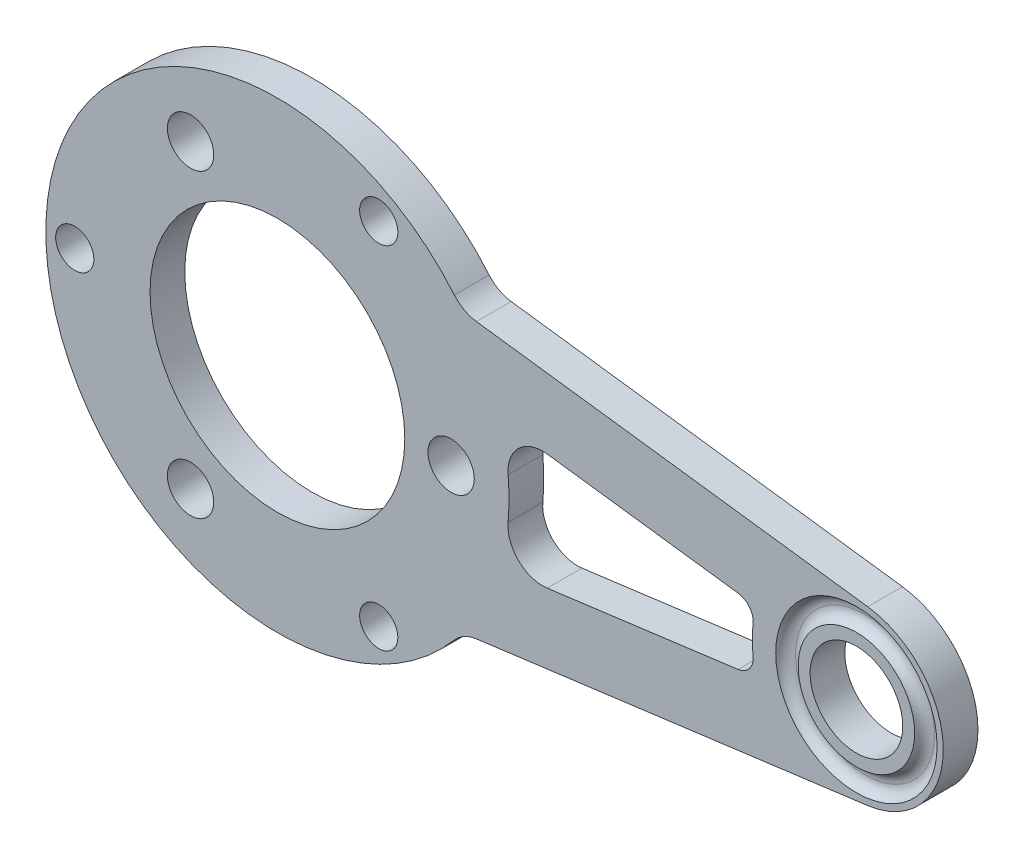
ISO-10303-21;
HEADER;
FILE_DESCRIPTION(('STEP AP214'),'2;1');
FILE_NAME('part.step','',(''),(''),'','','');
FILE_SCHEMA(('AUTOMOTIVE_DESIGN { 1 0 10303 214 1 1 1 1 }'));
ENDSEC;
DATA;
#1=APPLICATION_CONTEXT('core data for automotive mechanical design processes');
#2=APPLICATION_PROTOCOL_DEFINITION('international standard','automotive_design',2000,#1);
#3=PRODUCT_CONTEXT('',#1,'mechanical');
#4=PRODUCT('Part','Part','',(#3));
#5=PRODUCT_RELATED_PRODUCT_CATEGORY('part','',(#4));
#6=PRODUCT_DEFINITION_FORMATION('','',#4);
#7=PRODUCT_DEFINITION_CONTEXT('part definition',#1,'design');
#8=PRODUCT_DEFINITION('design','',#6,#7);
#9=PRODUCT_DEFINITION_SHAPE('','',#8);
#10=(LENGTH_UNIT() NAMED_UNIT(*) SI_UNIT(.MILLI.,.METRE.));
#11=(NAMED_UNIT(*) PLANE_ANGLE_UNIT() SI_UNIT($,.RADIAN.));
#12=(NAMED_UNIT(*) SI_UNIT($,.STERADIAN.) SOLID_ANGLE_UNIT());
#13=UNCERTAINTY_MEASURE_WITH_UNIT(LENGTH_MEASURE(1.E-05),#10,'distance_accuracy_value','');
#14=(GEOMETRIC_REPRESENTATION_CONTEXT(3) GLOBAL_UNCERTAINTY_ASSIGNED_CONTEXT((#13)) GLOBAL_UNIT_ASSIGNED_CONTEXT((#10,
#11,#12)) REPRESENTATION_CONTEXT('',''));
#15=CARTESIAN_POINT('',(0.,0.,0.));
#16=DIRECTION('',(0.,0.,1.));
#17=DIRECTION('',(1.,0.,0.));
#18=AXIS2_PLACEMENT_3D('',#15,#16,#17);
#19=CARTESIAN_POINT('',(0.,0.,3.));
#20=DIRECTION('',(0.,0.,1.));
#21=DIRECTION('',(1.,0.,0.));
#22=AXIS2_PLACEMENT_3D('',#19,#20,#21);
#23=PLANE('',#22);
#24=CARTESIAN_POINT('',(-7.49999999999988,12.9903810567666,3.));
#25=DIRECTION('',(0.,0.,1.));
#26=DIRECTION('',(1.,0.,0.));
#27=AXIS2_PLACEMENT_3D('',#24,#25,#26);
#28=CIRCLE('',#27,2.);
#29=CARTESIAN_POINT('',(-5.49999999999988,12.9903810567666,3.));
#30=VERTEX_POINT('',#29);
#31=EDGE_CURVE('E344',#30,#30,#28,.T.);
#32=ORIENTED_EDGE('',*,*,#31,.F.);
#33=EDGE_LOOP('',(#32));
#34=FACE_BOUND('',#33,.T.);
#35=CARTESIAN_POINT('',(8.74999999999986,-15.1554445662278,3.));
#36=DIRECTION('',(0.,0.,1.));
#37=DIRECTION('',(1.,0.,0.));
#38=AXIS2_PLACEMENT_3D('',#35,#36,#37);
#39=CIRCLE('',#38,1.65);
#40=CARTESIAN_POINT('',(10.3999999999999,-15.1554445662278,3.));
#41=VERTEX_POINT('',#40);
#42=EDGE_CURVE('E333',#41,#41,#39,.T.);
#43=ORIENTED_EDGE('',*,*,#42,.F.);
#44=EDGE_LOOP('',(#43));
#45=FACE_BOUND('',#44,.T.);
#46=CARTESIAN_POINT('',(8.75000000000007,15.1554445662276,3.));
#47=DIRECTION('',(0.,0.,1.));
#48=DIRECTION('',(1.,0.,0.));
#49=AXIS2_PLACEMENT_3D('',#46,#47,#48);
#50=CIRCLE('',#49,1.65);
#51=CARTESIAN_POINT('',(10.4000000000001,15.1554445662276,3.));
#52=VERTEX_POINT('',#51);
#53=EDGE_CURVE('E332',#52,#52,#50,.T.);
#54=ORIENTED_EDGE('',*,*,#53,.F.);
#55=EDGE_LOOP('',(#54));
#56=FACE_BOUND('',#55,.T.);
#57=CARTESIAN_POINT('',(-17.5,0.,3.));
#58=DIRECTION('',(0.,0.,1.));
#59=DIRECTION('',(1.,0.,0.));
#60=AXIS2_PLACEMENT_3D('',#57,#58,#59);
#61=CIRCLE('',#60,1.65);
#62=CARTESIAN_POINT('',(-15.85,0.,3.));
#63=VERTEX_POINT('',#62);
#64=EDGE_CURVE('E327',#63,#63,#61,.T.);
#65=ORIENTED_EDGE('',*,*,#64,.F.);
#66=EDGE_LOOP('',(#65));
#67=FACE_BOUND('',#66,.T.);
#68=CARTESIAN_POINT('',(15.0000000000006,9.44533978383532E-13,3.));
#69=DIRECTION('',(0.,0.,1.));
#70=DIRECTION('',(1.,0.,0.));
#71=AXIS2_PLACEMENT_3D('',#68,#69,#70);
#72=CIRCLE('',#71,2.00000000000125);
#73=CARTESIAN_POINT('',(17.0000000000018,9.44533978383532E-13,3.));
#74=VERTEX_POINT('',#73);
#75=EDGE_CURVE('E345',#74,#74,#72,.T.);
#76=ORIENTED_EDGE('',*,*,#75,.F.);
#77=EDGE_LOOP('',(#76));
#78=FACE_BOUND('',#77,.T.);
#79=CARTESIAN_POINT('',(-7.49999999999891,-12.9903810567666,3.));
#80=DIRECTION('',(0.,0.,1.));
#81=DIRECTION('',(1.,0.,0.));
#82=AXIS2_PLACEMENT_3D('',#79,#80,#81);
#83=CIRCLE('',#82,2.00000000000107);
#84=CARTESIAN_POINT('',(-5.49999999999784,-12.9903810567666,3.));
#85=VERTEX_POINT('',#84);
#86=EDGE_CURVE('E225',#85,#85,#83,.T.);
#87=ORIENTED_EDGE('',*,*,#86,.F.);
#88=EDGE_LOOP('',(#87));
#89=FACE_BOUND('',#88,.T.);
#90=CARTESIAN_POINT('',(0.,0.,3.));
#91=DIRECTION('',(0.,0.,1.));
#92=DIRECTION('',(1.,0.,0.));
#93=AXIS2_PLACEMENT_3D('',#90,#91,#92);
#94=CIRCLE('',#93,11.);
#95=CARTESIAN_POINT('',(11.,0.,3.));
#96=VERTEX_POINT('',#95);
#97=EDGE_CURVE('E265',#96,#96,#94,.T.);
#98=ORIENTED_EDGE('',*,*,#97,.F.);
#99=EDGE_LOOP('',(#98));
#100=FACE_BOUND('',#99,.T.);
#101=DIRECTION('',(0.99151399384981,0.13,0.));
#102=VECTOR('',#101,1.);
#103=CARTESIAN_POINT('',(1.82,-13.8811959138973,3.));
#104=LINE('',#103,#102);
#105=CARTESIAN_POINT('',(17.1804687428476,-11.8672445738695,3.));
#106=VERTEX_POINT('',#105);
#107=CARTESIAN_POINT('',(50.975,-7.43635495387357,3.));
#108=VERTEX_POINT('',#107);
#109=EDGE_CURVE('E157',#106,#108,#104,.T.);
#110=ORIENTED_EDGE('',*,*,#109,.T.);
#111=CARTESIAN_POINT('',(50.,0.,3.));
#112=DIRECTION('',(0.,0.,-1.));
#113=DIRECTION('',(-1.,0.,0.));
#114=AXIS2_PLACEMENT_3D('',#111,#112,#113);
#115=CIRCLE('',#114,7.5);
#116=CARTESIAN_POINT('',(50.975,7.43635495387357,3.));
#117=VERTEX_POINT('',#116);
#118=EDGE_CURVE('E144',#117,#108,#115,.T.);
#119=ORIENTED_EDGE('',*,*,#118,.F.);
#120=DIRECTION('',(-0.99151399384981,0.13,0.));
#121=VECTOR('',#120,1.);
#122=CARTESIAN_POINT('',(1.82,13.8811959138973,3.));
#123=LINE('',#122,#121);
#124=CARTESIAN_POINT('',(17.1804687428476,11.8672445738695,3.));
#125=VERTEX_POINT('',#124);
#126=EDGE_CURVE('E165',#117,#125,#123,.T.);
#127=ORIENTED_EDGE('',*,*,#126,.T.);
#128=CARTESIAN_POINT('',(17.5704687428476,14.8417865554189,3.));
#129=DIRECTION('',(0.,0.,1.));
#130=DIRECTION('',(1.,0.,0.));
#131=AXIS2_PLACEMENT_3D('',#128,#129,#130);
#132=CIRCLE('',#131,3.);
#133=CARTESIAN_POINT('',(15.2786684720414,12.9059013525382,3.));
#134=VERTEX_POINT('',#133);
#135=EDGE_CURVE('E50',#125,#134,#132,.F.);
#136=ORIENTED_EDGE('',*,*,#135,.T.);
#137=CARTESIAN_POINT('',(0.,0.,3.));
#138=DIRECTION('',(0.,0.,1.));
#139=DIRECTION('',(1.,0.,0.));
#140=AXIS2_PLACEMENT_3D('',#137,#138,#139);
#141=CIRCLE('',#140,20.);
#142=CARTESIAN_POINT('',(15.2786684720414,-12.9059013525382,3.));
#143=VERTEX_POINT('',#142);
#144=EDGE_CURVE('E254',#134,#143,#141,.T.);
#145=ORIENTED_EDGE('',*,*,#144,.T.);
#146=CARTESIAN_POINT('',(17.5704687428476,-14.8417865554189,3.));
#147=DIRECTION('',(0.,0.,1.));
#148=DIRECTION('',(1.,0.,0.));
#149=AXIS2_PLACEMENT_3D('',#146,#147,#148);
#150=CIRCLE('',#149,3.);
#151=EDGE_CURVE('E161',#143,#106,#150,.F.);
#152=ORIENTED_EDGE('',*,*,#151,.T.);
#153=EDGE_LOOP('',(#110,#119,#127,#136,#145,#152));
#154=FACE_BOUND('',#153,.T.);
#155=DIRECTION('',(0.991513993849809,0.13,0.));
#156=VECTOR('',#155,1.);
#157=CARTESIAN_POINT('',(16.0770542327944,-5.96056433534507,3.));
#158=LINE('',#157,#156);
#159=CARTESIAN_POINT('',(23.2994339550672,-5.0136191891148,3.));
#160=VERTEX_POINT('',#159);
#161=CARTESIAN_POINT('',(39.784103064577,-2.85227099077471,3.));
#162=VERTEX_POINT('',#161);
#163=EDGE_CURVE('E271',#160,#162,#158,.T.);
#164=ORIENTED_EDGE('',*,*,#163,.F.);
#165=CARTESIAN_POINT('',(22.9094339550672,-2.03907720756537,3.));
#166=DIRECTION('',(0.,0.,1.));
#167=DIRECTION('',(1.,0.,0.));
#168=AXIS2_PLACEMENT_3D('',#165,#166,#167);
#169=CIRCLE('',#168,3.);
#170=CARTESIAN_POINT('',(19.9212469174498,-1.77311061527423,3.));
#171=VERTEX_POINT('',#170);
#172=EDGE_CURVE('E207',#160,#171,#169,.F.);
#173=ORIENTED_EDGE('',*,*,#172,.T.);
#174=CARTESIAN_POINT('',(19.9212469174498,1.77311061527424,3.));
#175=VERTEX_POINT('',#174);
#176=EDGE_CURVE('E267',#171,#175,#141,.T.);
#177=ORIENTED_EDGE('',*,*,#176,.T.);
#178=CARTESIAN_POINT('',(22.9094339550672,2.03907720756537,3.));
#179=DIRECTION('',(0.,0.,1.));
#180=DIRECTION('',(1.,0.,0.));
#181=AXIS2_PLACEMENT_3D('',#178,#179,#180);
#182=CIRCLE('',#181,3.);
#183=CARTESIAN_POINT('',(23.2994339550672,5.0136191891148,3.));
#184=VERTEX_POINT('',#183);
#185=EDGE_CURVE('E216',#175,#184,#182,.F.);
#186=ORIENTED_EDGE('',*,*,#185,.T.);
#187=DIRECTION('',(-0.991513993849809,0.13,0.));
#188=VECTOR('',#187,1.);
#189=CARTESIAN_POINT('',(39.784103064577,2.85227099077471,3.));
#190=LINE('',#189,#188);
#191=CARTESIAN_POINT('',(39.784103064577,2.85227099077471,3.));
#192=VERTEX_POINT('',#191);
#193=EDGE_CURVE('E260',#192,#184,#190,.T.);
#194=ORIENTED_EDGE('',*,*,#193,.F.);
#195=CARTESIAN_POINT('',(39.589103064577,1.365,3.));
#196=DIRECTION('',(0.,0.,1.));
#197=DIRECTION('',(1.,0.,0.));
#198=AXIS2_PLACEMENT_3D('',#195,#196,#197);
#199=CIRCLE('',#198,1.5);
#200=CARTESIAN_POINT('',(41.0763740553517,1.17,3.));
#201=VERTEX_POINT('',#200);
#202=EDGE_CURVE('E257',#201,#192,#199,.T.);
#203=ORIENTED_EDGE('',*,*,#202,.F.);
#204=CARTESIAN_POINT('',(50.,0.,3.));
#205=DIRECTION('',(0.,0.,-1.));
#206=DIRECTION('',(1.,0.,0.));
#207=AXIS2_PLACEMENT_3D('',#204,#205,#206);
#208=CIRCLE('',#207,8.99999999999999);
#209=CARTESIAN_POINT('',(41.0763740553517,-1.16999999999999,3.));
#210=VERTEX_POINT('',#209);
#211=EDGE_CURVE('E276',#210,#201,#208,.T.);
#212=ORIENTED_EDGE('',*,*,#211,.F.);
#213=CARTESIAN_POINT('',(39.589103064577,-1.365,3.));
#214=DIRECTION('',(0.,0.,1.));
#215=DIRECTION('',(-1.,0.,0.));
#216=AXIS2_PLACEMENT_3D('',#213,#214,#215);
#217=CIRCLE('',#216,1.5);
#218=EDGE_CURVE('E273',#162,#210,#217,.T.);
#219=ORIENTED_EDGE('',*,*,#218,.F.);
#220=EDGE_LOOP('',(#164,#173,#177,#186,#194,#203,#212,#219));
#221=FACE_BOUND('',#220,.T.);
#222=CARTESIAN_POINT('',(50.,0.,3.));
#223=DIRECTION('',(0.,0.,-1.));
#224=DIRECTION('',(-1.,0.,0.));
#225=AXIS2_PLACEMENT_3D('',#222,#223,#224);
#226=CIRCLE('',#225,6.96824583655185);
#227=CARTESIAN_POINT('',(43.0317541634481,0.,3.));
#228=VERTEX_POINT('',#227);
#229=EDGE_CURVE('E228',#228,#228,#226,.F.);
#230=ORIENTED_EDGE('',*,*,#229,.F.);
#231=EDGE_LOOP('',(#230));
#232=FACE_BOUND('',#231,.T.);
#233=ADVANCED_FACE('F41',(#34,#45,#56,#67,#78,#89,#100,#154,#221,#232),#23,.T.);
#234=CARTESIAN_POINT('',(0.,0.,0.));
#235=DIRECTION('',(0.,0.,1.));
#236=DIRECTION('',(1.,0.,0.));
#237=AXIS2_PLACEMENT_3D('',#234,#235,#236);
#238=PLANE('',#237);
#239=CARTESIAN_POINT('',(-7.49999999999988,12.9903810567666,0.));
#240=DIRECTION('',(0.,0.,1.));
#241=DIRECTION('',(1.,0.,0.));
#242=AXIS2_PLACEMENT_3D('',#239,#240,#241);
#243=CIRCLE('',#242,2.);
#244=CARTESIAN_POINT('',(-5.49999999999988,12.9903810567666,0.));
#245=VERTEX_POINT('',#244);
#246=EDGE_CURVE('E341',#245,#245,#243,.T.);
#247=ORIENTED_EDGE('',*,*,#246,.T.);
#248=EDGE_LOOP('',(#247));
#249=FACE_BOUND('',#248,.T.);
#250=CARTESIAN_POINT('',(8.74999999999986,-15.1554445662278,0.));
#251=DIRECTION('',(0.,0.,1.));
#252=DIRECTION('',(1.,0.,0.));
#253=AXIS2_PLACEMENT_3D('',#250,#251,#252);
#254=CIRCLE('',#253,1.65);
#255=CARTESIAN_POINT('',(10.3999999999999,-15.1554445662278,0.));
#256=VERTEX_POINT('',#255);
#257=EDGE_CURVE('E348',#256,#256,#254,.T.);
#258=ORIENTED_EDGE('',*,*,#257,.T.);
#259=EDGE_LOOP('',(#258));
#260=FACE_BOUND('',#259,.T.);
#261=CARTESIAN_POINT('',(8.75000000000007,15.1554445662276,0.));
#262=DIRECTION('',(0.,0.,1.));
#263=DIRECTION('',(1.,0.,0.));
#264=AXIS2_PLACEMENT_3D('',#261,#262,#263);
#265=CIRCLE('',#264,1.65);
#266=CARTESIAN_POINT('',(10.4000000000001,15.1554445662276,0.));
#267=VERTEX_POINT('',#266);
#268=EDGE_CURVE('E329',#267,#267,#265,.T.);
#269=ORIENTED_EDGE('',*,*,#268,.T.);
#270=EDGE_LOOP('',(#269));
#271=FACE_BOUND('',#270,.T.);
#272=CARTESIAN_POINT('',(-17.5,0.,0.));
#273=DIRECTION('',(0.,0.,1.));
#274=DIRECTION('',(1.,0.,0.));
#275=AXIS2_PLACEMENT_3D('',#272,#273,#274);
#276=CIRCLE('',#275,1.65);
#277=CARTESIAN_POINT('',(-15.85,0.,0.));
#278=VERTEX_POINT('',#277);
#279=EDGE_CURVE('E336',#278,#278,#276,.T.);
#280=ORIENTED_EDGE('',*,*,#279,.T.);
#281=EDGE_LOOP('',(#280));
#282=FACE_BOUND('',#281,.T.);
#283=CARTESIAN_POINT('',(15.0000000000006,9.44533978383532E-13,0.));
#284=DIRECTION('',(0.,0.,1.));
#285=DIRECTION('',(1.,0.,0.));
#286=AXIS2_PLACEMENT_3D('',#283,#284,#285);
#287=CIRCLE('',#286,2.00000000000125);
#288=CARTESIAN_POINT('',(17.0000000000018,9.44533978383532E-13,0.));
#289=VERTEX_POINT('',#288);
#290=EDGE_CURVE('E355',#289,#289,#287,.T.);
#291=ORIENTED_EDGE('',*,*,#290,.T.);
#292=EDGE_LOOP('',(#291));
#293=FACE_BOUND('',#292,.T.);
#294=CARTESIAN_POINT('',(-7.49999999999891,-12.9903810567666,0.));
#295=DIRECTION('',(0.,0.,1.));
#296=DIRECTION('',(1.,0.,0.));
#297=AXIS2_PLACEMENT_3D('',#294,#295,#296);
#298=CIRCLE('',#297,2.00000000000107);
#299=CARTESIAN_POINT('',(-5.49999999999784,-12.9903810567666,0.));
#300=VERTEX_POINT('',#299);
#301=EDGE_CURVE('E220',#300,#300,#298,.T.);
#302=ORIENTED_EDGE('',*,*,#301,.T.);
#303=EDGE_LOOP('',(#302));
#304=FACE_BOUND('',#303,.T.);
#305=CARTESIAN_POINT('',(0.,0.,0.));
#306=DIRECTION('',(0.,0.,1.));
#307=DIRECTION('',(1.,0.,0.));
#308=AXIS2_PLACEMENT_3D('',#305,#306,#307);
#309=CIRCLE('',#308,11.);
#310=CARTESIAN_POINT('',(11.,0.,0.));
#311=VERTEX_POINT('',#310);
#312=EDGE_CURVE('E322',#311,#311,#309,.T.);
#313=ORIENTED_EDGE('',*,*,#312,.T.);
#314=EDGE_LOOP('',(#313));
#315=FACE_BOUND('',#314,.T.);
#316=CARTESIAN_POINT('',(0.,0.,0.));
#317=DIRECTION('',(0.,0.,1.));
#318=DIRECTION('',(1.,0.,0.));
#319=AXIS2_PLACEMENT_3D('',#316,#317,#318);
#320=CIRCLE('',#319,20.);
#321=CARTESIAN_POINT('',(15.2786684720414,12.9059013525382,0.));
#322=VERTEX_POINT('',#321);
#323=CARTESIAN_POINT('',(15.2786684720414,-12.9059013525382,0.));
#324=VERTEX_POINT('',#323);
#325=EDGE_CURVE('E252',#322,#324,#320,.T.);
#326=ORIENTED_EDGE('',*,*,#325,.F.);
#327=CARTESIAN_POINT('',(17.5704687428476,14.8417865554189,0.));
#328=DIRECTION('',(0.,0.,1.));
#329=DIRECTION('',(1.,0.,0.));
#330=AXIS2_PLACEMENT_3D('',#327,#328,#329);
#331=CIRCLE('',#330,3.);
#332=CARTESIAN_POINT('',(17.1804687428476,11.8672445738695,0.));
#333=VERTEX_POINT('',#332);
#334=EDGE_CURVE('E11',#322,#333,#331,.T.);
#335=ORIENTED_EDGE('',*,*,#334,.T.);
#336=DIRECTION('',(-0.99151399384981,0.13,0.));
#337=VECTOR('',#336,1.);
#338=CARTESIAN_POINT('',(1.82,13.8811959138973,0.));
#339=LINE('',#338,#337);
#340=CARTESIAN_POINT('',(50.975,7.43635495387357,0.));
#341=VERTEX_POINT('',#340);
#342=EDGE_CURVE('E166',#341,#333,#339,.T.);
#343=ORIENTED_EDGE('',*,*,#342,.F.);
#344=CARTESIAN_POINT('',(50.,0.,0.));
#345=DIRECTION('',(0.,0.,1.));
#346=DIRECTION('',(1.,0.,0.));
#347=AXIS2_PLACEMENT_3D('',#344,#345,#346);
#348=CIRCLE('',#347,7.5);
#349=CARTESIAN_POINT('',(50.975,-7.43635495387357,0.));
#350=VERTEX_POINT('',#349);
#351=EDGE_CURVE('E244',#350,#341,#348,.T.);
#352=ORIENTED_EDGE('',*,*,#351,.F.);
#353=DIRECTION('',(0.99151399384981,0.13,0.));
#354=VECTOR('',#353,1.);
#355=CARTESIAN_POINT('',(1.82,-13.8811959138973,0.));
#356=LINE('',#355,#354);
#357=CARTESIAN_POINT('',(17.1804687428476,-11.8672445738695,0.));
#358=VERTEX_POINT('',#357);
#359=EDGE_CURVE('E170',#358,#350,#356,.T.);
#360=ORIENTED_EDGE('',*,*,#359,.F.);
#361=CARTESIAN_POINT('',(17.5704687428476,-14.8417865554189,0.));
#362=DIRECTION('',(0.,0.,1.));
#363=DIRECTION('',(1.,0.,0.));
#364=AXIS2_PLACEMENT_3D('',#361,#362,#363);
#365=CIRCLE('',#364,3.);
#366=EDGE_CURVE('E211',#358,#324,#365,.T.);
#367=ORIENTED_EDGE('',*,*,#366,.T.);
#368=EDGE_LOOP('',(#326,#335,#343,#352,#360,#367));
#369=FACE_BOUND('',#368,.T.);
#370=DIRECTION('',(-0.99151399384981,0.13,0.));
#371=VECTOR('',#370,1.);
#372=CARTESIAN_POINT('',(1.04,7.93211195079847,0.));
#373=LINE('',#372,#371);
#374=CARTESIAN_POINT('',(39.784103064577,2.85227099077471,0.));
#375=VERTEX_POINT('',#374);
#376=CARTESIAN_POINT('',(23.2994339550672,5.0136191891148,0.));
#377=VERTEX_POINT('',#376);
#378=EDGE_CURVE('E171',#375,#377,#373,.T.);
#379=ORIENTED_EDGE('',*,*,#378,.T.);
#380=CARTESIAN_POINT('',(22.9094339550672,2.03907720756537,0.));
#381=DIRECTION('',(0.,0.,1.));
#382=DIRECTION('',(1.,0.,0.));
#383=AXIS2_PLACEMENT_3D('',#380,#381,#382);
#384=CIRCLE('',#383,3.);
#385=CARTESIAN_POINT('',(19.9212469174498,1.77311061527424,0.));
#386=VERTEX_POINT('',#385);
#387=EDGE_CURVE('E214',#377,#386,#384,.T.);
#388=ORIENTED_EDGE('',*,*,#387,.T.);
#389=CARTESIAN_POINT('',(19.9212469174498,-1.77311061527423,0.));
#390=VERTEX_POINT('',#389);
#391=EDGE_CURVE('E258',#390,#386,#320,.T.);
#392=ORIENTED_EDGE('',*,*,#391,.F.);
#393=CARTESIAN_POINT('',(22.9094339550672,-2.03907720756537,0.));
#394=DIRECTION('',(0.,0.,1.));
#395=DIRECTION('',(1.,0.,0.));
#396=AXIS2_PLACEMENT_3D('',#393,#394,#395);
#397=CIRCLE('',#396,3.);
#398=CARTESIAN_POINT('',(23.2994339550672,-5.0136191891148,0.));
#399=VERTEX_POINT('',#398);
#400=EDGE_CURVE('E209',#390,#399,#397,.T.);
#401=ORIENTED_EDGE('',*,*,#400,.T.);
#402=DIRECTION('',(0.99151399384981,0.13,0.));
#403=VECTOR('',#402,1.);
#404=CARTESIAN_POINT('',(1.04,-7.93211195079847,0.));
#405=LINE('',#404,#403);
#406=CARTESIAN_POINT('',(39.784103064577,-2.85227099077471,0.));
#407=VERTEX_POINT('',#406);
#408=EDGE_CURVE('E174',#399,#407,#405,.T.);
#409=ORIENTED_EDGE('',*,*,#408,.T.);
#410=CARTESIAN_POINT('',(39.589103064577,-1.365,0.));
#411=DIRECTION('',(0.,0.,1.));
#412=DIRECTION('',(1.,0.,0.));
#413=AXIS2_PLACEMENT_3D('',#410,#411,#412);
#414=CIRCLE('',#413,1.5);
#415=CARTESIAN_POINT('',(41.0763740553517,-1.16999999999999,0.));
#416=VERTEX_POINT('',#415);
#417=EDGE_CURVE('E180',#407,#416,#414,.T.);
#418=ORIENTED_EDGE('',*,*,#417,.T.);
#419=CARTESIAN_POINT('',(50.,0.,0.));
#420=DIRECTION('',(0.,0.,1.));
#421=DIRECTION('',(1.,0.,0.));
#422=AXIS2_PLACEMENT_3D('',#419,#420,#421);
#423=CIRCLE('',#422,8.99999999999999);
#424=CARTESIAN_POINT('',(41.0763740553517,1.17,0.));
#425=VERTEX_POINT('',#424);
#426=EDGE_CURVE('E183',#416,#425,#423,.F.);
#427=ORIENTED_EDGE('',*,*,#426,.T.);
#428=CARTESIAN_POINT('',(39.589103064577,1.365,0.));
#429=DIRECTION('',(0.,0.,1.));
#430=DIRECTION('',(1.,0.,0.));
#431=AXIS2_PLACEMENT_3D('',#428,#429,#430);
#432=CIRCLE('',#431,1.5);
#433=EDGE_CURVE('E186',#425,#375,#432,.T.);
#434=ORIENTED_EDGE('',*,*,#433,.T.);
#435=EDGE_LOOP('',(#379,#388,#392,#401,#409,#418,#427,#434));
#436=FACE_BOUND('',#435,.T.);
#437=CARTESIAN_POINT('',(50.,0.,0.));
#438=DIRECTION('',(0.,0.,1.));
#439=DIRECTION('',(1.,0.,0.));
#440=AXIS2_PLACEMENT_3D('',#437,#438,#439);
#441=CIRCLE('',#440,4.00000000000001);
#442=CARTESIAN_POINT('',(54.,0.,0.));
#443=VERTEX_POINT('',#442);
#444=EDGE_CURVE('E238',#443,#443,#441,.T.);
#445=ORIENTED_EDGE('',*,*,#444,.T.);
#446=EDGE_LOOP('',(#445));
#447=FACE_BOUND('',#446,.T.);
#448=ADVANCED_FACE('F255',(#249,#260,#271,#282,#293,#304,#315,#369,#436,#447),#238,.F.);
#449=CARTESIAN_POINT('',(1.82,-13.8811959138973,3.));
#450=DIRECTION('',(-0.13,0.991513993849809,0.));
#451=DIRECTION('',(-0.991513993849809,-0.13,0.));
#452=AXIS2_PLACEMENT_3D('',#449,#450,#451);
#453=PLANE('',#452);
#454=ORIENTED_EDGE('',*,*,#109,.F.);
#455=DIRECTION('',(0.,0.,1.));
#456=VECTOR('',#455,1.);
#457=CARTESIAN_POINT('',(17.1804687428476,-11.8672445738695,3.));
#458=LINE('',#457,#456);
#459=EDGE_CURVE('E196',#106,#358,#458,.F.);
#460=ORIENTED_EDGE('',*,*,#459,.T.);
#461=ORIENTED_EDGE('',*,*,#359,.T.);
#462=DIRECTION('',(0.,0.,-1.));
#463=VECTOR('',#462,1.);
#464=CARTESIAN_POINT('',(50.975,-7.43635495387357,3.));
#465=LINE('',#464,#463);
#466=EDGE_CURVE('E148',#108,#350,#465,.T.);
#467=ORIENTED_EDGE('',*,*,#466,.F.);
#468=EDGE_LOOP('',(#454,#460,#461,#467));
#469=FACE_BOUND('',#468,.T.);
#470=ADVANCED_FACE('F168',(#469),#453,.F.);
#471=CARTESIAN_POINT('',(50.,0.,3.));
#472=DIRECTION('',(0.,0.,-1.));
#473=DIRECTION('',(-1.,0.,0.));
#474=AXIS2_PLACEMENT_3D('',#471,#472,#473);
#475=CYLINDRICAL_SURFACE('',#474,7.5);
#476=DIRECTION('',(0.,0.,-1.));
#477=VECTOR('',#476,1.);
#478=CARTESIAN_POINT('',(50.975,7.43635495387357,3.));
#479=LINE('',#478,#477);
#480=EDGE_CURVE('E151',#117,#341,#479,.T.);
#481=ORIENTED_EDGE('',*,*,#480,.F.);
#482=ORIENTED_EDGE('',*,*,#118,.T.);
#483=ORIENTED_EDGE('',*,*,#466,.T.);
#484=ORIENTED_EDGE('',*,*,#351,.T.);
#485=EDGE_LOOP('',(#481,#482,#483,#484));
#486=FACE_BOUND('',#485,.T.);
#487=ADVANCED_FACE('F146',(#486),#475,.T.);
#488=CARTESIAN_POINT('',(1.82,13.8811959138973,3.));
#489=DIRECTION('',(-0.13,-0.991513993849809,0.));
#490=DIRECTION('',(0.991513993849809,-0.13,0.));
#491=AXIS2_PLACEMENT_3D('',#488,#489,#490);
#492=PLANE('',#491);
#493=ORIENTED_EDGE('',*,*,#342,.T.);
#494=DIRECTION('',(0.,0.,1.));
#495=VECTOR('',#494,1.);
#496=CARTESIAN_POINT('',(17.1804687428476,11.8672445738695,3.));
#497=LINE('',#496,#495);
#498=EDGE_CURVE('E205',#333,#125,#497,.T.);
#499=ORIENTED_EDGE('',*,*,#498,.T.);
#500=ORIENTED_EDGE('',*,*,#126,.F.);
#501=ORIENTED_EDGE('',*,*,#480,.T.);
#502=EDGE_LOOP('',(#493,#499,#500,#501));
#503=FACE_BOUND('',#502,.T.);
#504=ADVANCED_FACE('F246',(#503),#492,.F.);
#505=CARTESIAN_POINT('',(50.,0.,3.));
#506=DIRECTION('',(0.,0.,-1.));
#507=DIRECTION('',(-1.,0.,0.));
#508=AXIS2_PLACEMENT_3D('',#505,#506,#507);
#509=CYLINDRICAL_SURFACE('',#508,4.00000000000001);
#510=CARTESIAN_POINT('',(50.,0.,3.));
#511=DIRECTION('',(0.,0.,1.));
#512=DIRECTION('',(1.,0.,0.));
#513=AXIS2_PLACEMENT_3D('',#510,#511,#512);
#514=CIRCLE('',#513,4.00000000000001);
#515=CARTESIAN_POINT('',(54.,0.,3.));
#516=VERTEX_POINT('',#515);
#517=EDGE_CURVE('E221',#516,#516,#514,.T.);
#518=ORIENTED_EDGE('',*,*,#517,.T.);
#519=EDGE_LOOP('',(#518));
#520=FACE_BOUND('',#519,.T.);
#521=ORIENTED_EDGE('',*,*,#444,.F.);
#522=EDGE_LOOP('',(#521));
#523=FACE_BOUND('',#522,.T.);
#524=ADVANCED_FACE('F397',(#520,#523),#509,.F.);
#525=CARTESIAN_POINT('',(39.589103064577,1.365,-2.));
#526=DIRECTION('',(0.,0.,1.));
#527=DIRECTION('',(1.,0.,0.));
#528=AXIS2_PLACEMENT_3D('',#525,#526,#527);
#529=CYLINDRICAL_SURFACE('',#528,1.5);
#530=DIRECTION('',(0.,0.,1.));
#531=VECTOR('',#530,1.);
#532=CARTESIAN_POINT('',(41.0763740553517,1.17,-2.));
#533=LINE('',#532,#531);
#534=EDGE_CURVE('E240',#425,#201,#533,.T.);
#535=ORIENTED_EDGE('',*,*,#534,.T.);
#536=ORIENTED_EDGE('',*,*,#202,.T.);
#537=DIRECTION('',(0.,0.,1.));
#538=VECTOR('',#537,1.);
#539=CARTESIAN_POINT('',(39.784103064577,2.85227099077471,-2.));
#540=LINE('',#539,#538);
#541=EDGE_CURVE('E236',#375,#192,#540,.T.);
#542=ORIENTED_EDGE('',*,*,#541,.F.);
#543=ORIENTED_EDGE('',*,*,#433,.F.);
#544=EDGE_LOOP('',(#535,#536,#542,#543));
#545=FACE_BOUND('',#544,.T.);
#546=ADVANCED_FACE('F307',(#545),#529,.F.);
#547=CARTESIAN_POINT('',(50.,0.,-2.));
#548=DIRECTION('',(0.,0.,1.));
#549=DIRECTION('',(1.,0.,0.));
#550=AXIS2_PLACEMENT_3D('',#547,#548,#549);
#551=CYLINDRICAL_SURFACE('',#550,8.99999999999999);
#552=DIRECTION('',(0.,0.,1.));
#553=VECTOR('',#552,1.);
#554=CARTESIAN_POINT('',(41.0763740553517,-1.16999999999999,-2.));
#555=LINE('',#554,#553);
#556=EDGE_CURVE('E280',#416,#210,#555,.T.);
#557=ORIENTED_EDGE('',*,*,#556,.T.);
#558=ORIENTED_EDGE('',*,*,#211,.T.);
#559=ORIENTED_EDGE('',*,*,#534,.F.);
#560=ORIENTED_EDGE('',*,*,#426,.F.);
#561=EDGE_LOOP('',(#557,#558,#559,#560));
#562=FACE_BOUND('',#561,.T.);
#563=ADVANCED_FACE('F309',(#562),#551,.T.);
#564=CARTESIAN_POINT('',(39.589103064577,-1.365,-2.));
#565=DIRECTION('',(0.,0.,1.));
#566=DIRECTION('',(1.,0.,0.));
#567=AXIS2_PLACEMENT_3D('',#564,#565,#566);
#568=CYLINDRICAL_SURFACE('',#567,1.5);
#569=DIRECTION('',(0.,0.,1.));
#570=VECTOR('',#569,1.);
#571=CARTESIAN_POINT('',(39.784103064577,-2.85227099077471,-2.));
#572=LINE('',#571,#570);
#573=EDGE_CURVE('E281',#407,#162,#572,.T.);
#574=ORIENTED_EDGE('',*,*,#573,.T.);
#575=ORIENTED_EDGE('',*,*,#218,.T.);
#576=ORIENTED_EDGE('',*,*,#556,.F.);
#577=ORIENTED_EDGE('',*,*,#417,.F.);
#578=EDGE_LOOP('',(#574,#575,#576,#577));
#579=FACE_BOUND('',#578,.T.);
#580=ADVANCED_FACE('F311',(#579),#568,.F.);
#581=CARTESIAN_POINT('',(16.0770542327944,-5.96056433534507,-2.));
#582=DIRECTION('',(0.13,-0.99151399384981,0.));
#583=DIRECTION('',(0.99151399384981,0.13,0.));
#584=AXIS2_PLACEMENT_3D('',#581,#582,#583);
#585=PLANE('',#584);
#586=ORIENTED_EDGE('',*,*,#408,.F.);
#587=DIRECTION('',(0.,0.,1.));
#588=VECTOR('',#587,1.);
#589=CARTESIAN_POINT('',(23.2994339550672,-5.0136191891148,-2.));
#590=LINE('',#589,#588);
#591=EDGE_CURVE('E189',#399,#160,#590,.T.);
#592=ORIENTED_EDGE('',*,*,#591,.T.);
#593=ORIENTED_EDGE('',*,*,#163,.T.);
#594=ORIENTED_EDGE('',*,*,#573,.F.);
#595=EDGE_LOOP('',(#586,#592,#593,#594));
#596=FACE_BOUND('',#595,.T.);
#597=ADVANCED_FACE('F316',(#596),#585,.F.);
#598=CARTESIAN_POINT('',(39.784103064577,2.85227099077471,-2.));
#599=DIRECTION('',(0.13,0.99151399384981,0.));
#600=DIRECTION('',(-0.99151399384981,0.13,0.));
#601=AXIS2_PLACEMENT_3D('',#598,#599,#600);
#602=PLANE('',#601);
#603=ORIENTED_EDGE('',*,*,#193,.T.);
#604=DIRECTION('',(0.,0.,1.));
#605=VECTOR('',#604,1.);
#606=CARTESIAN_POINT('',(23.2994339550672,5.0136191891148,-2.));
#607=LINE('',#606,#605);
#608=EDGE_CURVE('E202',#184,#377,#607,.F.);
#609=ORIENTED_EDGE('',*,*,#608,.T.);
#610=ORIENTED_EDGE('',*,*,#378,.F.);
#611=ORIENTED_EDGE('',*,*,#541,.T.);
#612=EDGE_LOOP('',(#603,#609,#610,#611));
#613=FACE_BOUND('',#612,.T.);
#614=ADVANCED_FACE('F291',(#613),#602,.F.);
#615=CARTESIAN_POINT('',(0.,0.,0.));
#616=DIRECTION('',(0.,0.,1.));
#617=DIRECTION('',(1.,0.,0.));
#618=AXIS2_PLACEMENT_3D('',#615,#616,#617);
#619=CYLINDRICAL_SURFACE('',#618,20.);
#620=ORIENTED_EDGE('',*,*,#176,.F.);
#621=DIRECTION('',(0.,0.,1.));
#622=VECTOR('',#621,1.);
#623=CARTESIAN_POINT('',(19.9212469174498,-1.77311061527423,0.));
#624=LINE('',#623,#622);
#625=EDGE_CURVE('E194',#171,#390,#624,.F.);
#626=ORIENTED_EDGE('',*,*,#625,.T.);
#627=ORIENTED_EDGE('',*,*,#391,.T.);
#628=DIRECTION('',(0.,0.,1.));
#629=VECTOR('',#628,1.);
#630=CARTESIAN_POINT('',(19.9212469174498,1.77311061527424,0.));
#631=LINE('',#630,#629);
#632=EDGE_CURVE('E192',#386,#175,#631,.T.);
#633=ORIENTED_EDGE('',*,*,#632,.T.);
#634=EDGE_LOOP('',(#620,#626,#627,#633));
#635=FACE_BOUND('',#634,.T.);
#636=ADVANCED_FACE('F321',(#635),#619,.T.);
#637=ORIENTED_EDGE('',*,*,#325,.T.);
#638=DIRECTION('',(0.,0.,1.));
#639=VECTOR('',#638,1.);
#640=CARTESIAN_POINT('',(15.2786684720414,-12.9059013525382,0.));
#641=LINE('',#640,#639);
#642=EDGE_CURVE('E200',#324,#143,#641,.T.);
#643=ORIENTED_EDGE('',*,*,#642,.T.);
#644=ORIENTED_EDGE('',*,*,#144,.F.);
#645=DIRECTION('',(0.,0.,1.));
#646=VECTOR('',#645,1.);
#647=CARTESIAN_POINT('',(15.2786684720414,12.9059013525382,0.));
#648=LINE('',#647,#646);
#649=EDGE_CURVE('E198',#134,#322,#648,.F.);
#650=ORIENTED_EDGE('',*,*,#649,.T.);
#651=EDGE_LOOP('',(#637,#643,#644,#650));
#652=FACE_BOUND('',#651,.T.);
#653=ADVANCED_FACE('F251',(#652),#619,.T.);
#654=CARTESIAN_POINT('',(0.,0.,0.));
#655=DIRECTION('',(0.,0.,1.));
#656=DIRECTION('',(1.,0.,0.));
#657=AXIS2_PLACEMENT_3D('',#654,#655,#656);
#658=CYLINDRICAL_SURFACE('',#657,11.);
#659=ORIENTED_EDGE('',*,*,#312,.F.);
#660=EDGE_LOOP('',(#659));
#661=FACE_BOUND('',#660,.T.);
#662=ORIENTED_EDGE('',*,*,#97,.T.);
#663=EDGE_LOOP('',(#662));
#664=FACE_BOUND('',#663,.T.);
#665=ADVANCED_FACE('F371',(#661,#664),#658,.F.);
#666=CARTESIAN_POINT('',(-7.49999999999891,-12.9903810567666,0.));
#667=DIRECTION('',(0.,0.,1.));
#668=DIRECTION('',(1.,0.,0.));
#669=AXIS2_PLACEMENT_3D('',#666,#667,#668);
#670=CYLINDRICAL_SURFACE('',#669,2.00000000000107);
#671=ORIENTED_EDGE('',*,*,#301,.F.);
#672=EDGE_LOOP('',(#671));
#673=FACE_BOUND('',#672,.T.);
#674=ORIENTED_EDGE('',*,*,#86,.T.);
#675=EDGE_LOOP('',(#674));
#676=FACE_BOUND('',#675,.T.);
#677=ADVANCED_FACE('F373',(#673,#676),#670,.F.);
#678=CARTESIAN_POINT('',(15.0000000000006,9.44533978383532E-13,0.));
#679=DIRECTION('',(0.,0.,1.));
#680=DIRECTION('',(1.,0.,0.));
#681=AXIS2_PLACEMENT_3D('',#678,#679,#680);
#682=CYLINDRICAL_SURFACE('',#681,2.00000000000125);
#683=ORIENTED_EDGE('',*,*,#290,.F.);
#684=EDGE_LOOP('',(#683));
#685=FACE_BOUND('',#684,.T.);
#686=ORIENTED_EDGE('',*,*,#75,.T.);
#687=EDGE_LOOP('',(#686));
#688=FACE_BOUND('',#687,.T.);
#689=ADVANCED_FACE('F361',(#685,#688),#682,.F.);
#690=CARTESIAN_POINT('',(-17.5,0.,0.));
#691=DIRECTION('',(0.,0.,1.));
#692=DIRECTION('',(1.,0.,0.));
#693=AXIS2_PLACEMENT_3D('',#690,#691,#692);
#694=CYLINDRICAL_SURFACE('',#693,1.65);
#695=ORIENTED_EDGE('',*,*,#279,.F.);
#696=EDGE_LOOP('',(#695));
#697=FACE_BOUND('',#696,.T.);
#698=ORIENTED_EDGE('',*,*,#64,.T.);
#699=EDGE_LOOP('',(#698));
#700=FACE_BOUND('',#699,.T.);
#701=ADVANCED_FACE('F437',(#697,#700),#694,.F.);
#702=CARTESIAN_POINT('',(8.75000000000007,15.1554445662276,0.));
#703=DIRECTION('',(0.,0.,1.));
#704=DIRECTION('',(1.,0.,0.));
#705=AXIS2_PLACEMENT_3D('',#702,#703,#704);
#706=CYLINDRICAL_SURFACE('',#705,1.65);
#707=ORIENTED_EDGE('',*,*,#268,.F.);
#708=EDGE_LOOP('',(#707));
#709=FACE_BOUND('',#708,.T.);
#710=ORIENTED_EDGE('',*,*,#53,.T.);
#711=EDGE_LOOP('',(#710));
#712=FACE_BOUND('',#711,.T.);
#713=ADVANCED_FACE('F385',(#709,#712),#706,.F.);
#714=CARTESIAN_POINT('',(8.74999999999986,-15.1554445662278,0.));
#715=DIRECTION('',(0.,0.,1.));
#716=DIRECTION('',(1.,0.,0.));
#717=AXIS2_PLACEMENT_3D('',#714,#715,#716);
#718=CYLINDRICAL_SURFACE('',#717,1.65);
#719=ORIENTED_EDGE('',*,*,#257,.F.);
#720=EDGE_LOOP('',(#719));
#721=FACE_BOUND('',#720,.T.);
#722=ORIENTED_EDGE('',*,*,#42,.T.);
#723=EDGE_LOOP('',(#722));
#724=FACE_BOUND('',#723,.T.);
#725=ADVANCED_FACE('F440',(#721,#724),#718,.F.);
#726=CARTESIAN_POINT('',(-7.49999999999988,12.9903810567666,0.));
#727=DIRECTION('',(0.,0.,1.));
#728=DIRECTION('',(1.,0.,0.));
#729=AXIS2_PLACEMENT_3D('',#726,#727,#728);
#730=CYLINDRICAL_SURFACE('',#729,2.);
#731=ORIENTED_EDGE('',*,*,#246,.F.);
#732=EDGE_LOOP('',(#731));
#733=FACE_BOUND('',#732,.T.);
#734=ORIENTED_EDGE('',*,*,#31,.T.);
#735=EDGE_LOOP('',(#734));
#736=FACE_BOUND('',#735,.T.);
#737=ADVANCED_FACE('F412',(#733,#736),#730,.F.);
#738=CARTESIAN_POINT('',(22.9094339550672,-2.03907720756537,0.));
#739=DIRECTION('',(0.,0.,1.));
#740=DIRECTION('',(1.,0.,0.));
#741=AXIS2_PLACEMENT_3D('',#738,#739,#740);
#742=CYLINDRICAL_SURFACE('',#741,3.);
#743=ORIENTED_EDGE('',*,*,#400,.F.);
#744=ORIENTED_EDGE('',*,*,#625,.F.);
#745=ORIENTED_EDGE('',*,*,#172,.F.);
#746=ORIENTED_EDGE('',*,*,#591,.F.);
#747=EDGE_LOOP('',(#743,#744,#745,#746));
#748=FACE_BOUND('',#747,.T.);
#749=ADVANCED_FACE('F318',(#748),#742,.F.);
#750=CARTESIAN_POINT('',(17.5704687428476,-14.8417865554189,0.));
#751=DIRECTION('',(0.,0.,1.));
#752=DIRECTION('',(1.,0.,0.));
#753=AXIS2_PLACEMENT_3D('',#750,#751,#752);
#754=CYLINDRICAL_SURFACE('',#753,3.);
#755=ORIENTED_EDGE('',*,*,#151,.F.);
#756=ORIENTED_EDGE('',*,*,#642,.F.);
#757=ORIENTED_EDGE('',*,*,#366,.F.);
#758=ORIENTED_EDGE('',*,*,#459,.F.);
#759=EDGE_LOOP('',(#755,#756,#757,#758));
#760=FACE_BOUND('',#759,.T.);
#761=ADVANCED_FACE('F411',(#760),#754,.F.);
#762=CARTESIAN_POINT('',(22.9094339550672,2.03907720756537,0.));
#763=DIRECTION('',(0.,0.,1.));
#764=DIRECTION('',(1.,0.,0.));
#765=AXIS2_PLACEMENT_3D('',#762,#763,#764);
#766=CYLINDRICAL_SURFACE('',#765,3.);
#767=ORIENTED_EDGE('',*,*,#185,.F.);
#768=ORIENTED_EDGE('',*,*,#632,.F.);
#769=ORIENTED_EDGE('',*,*,#387,.F.);
#770=ORIENTED_EDGE('',*,*,#608,.F.);
#771=EDGE_LOOP('',(#767,#768,#769,#770));
#772=FACE_BOUND('',#771,.T.);
#773=ADVANCED_FACE('F303',(#772),#766,.F.);
#774=CARTESIAN_POINT('',(17.5704687428476,14.8417865554189,0.));
#775=DIRECTION('',(0.,0.,1.));
#776=DIRECTION('',(1.,0.,0.));
#777=AXIS2_PLACEMENT_3D('',#774,#775,#776);
#778=CYLINDRICAL_SURFACE('',#777,3.);
#779=ORIENTED_EDGE('',*,*,#334,.F.);
#780=ORIENTED_EDGE('',*,*,#649,.F.);
#781=ORIENTED_EDGE('',*,*,#135,.F.);
#782=ORIENTED_EDGE('',*,*,#498,.F.);
#783=EDGE_LOOP('',(#779,#780,#781,#782));
#784=FACE_BOUND('',#783,.T.);
#785=ADVANCED_FACE('F247',(#784),#778,.F.);
#786=CARTESIAN_POINT('',(50.,0.,3.));
#787=DIRECTION('',(0.,0.,-1.));
#788=DIRECTION('',(-1.,0.,0.));
#789=AXIS2_PLACEMENT_3D('',#786,#787,#788);
#790=PLANE('',#789);
#791=CARTESIAN_POINT('',(50.,0.,3.));
#792=DIRECTION('',(0.,0.,1.));
#793=DIRECTION('',(1.,0.,0.));
#794=AXIS2_PLACEMENT_3D('',#791,#792,#793);
#795=CIRCLE('',#794,5.03175416344814);
#796=CARTESIAN_POINT('',(55.0317541634481,0.,3.));
#797=VERTEX_POINT('',#796);
#798=EDGE_CURVE('E45',#797,#797,#795,.F.);
#799=ORIENTED_EDGE('',*,*,#798,.F.);
#800=EDGE_LOOP('',(#799));
#801=FACE_BOUND('',#800,.T.);
#802=ORIENTED_EDGE('',*,*,#517,.F.);
#803=EDGE_LOOP('',(#802));
#804=FACE_BOUND('',#803,.T.);
#805=ADVANCED_FACE('F419',(#801,#804),#790,.F.);
#806=CARTESIAN_POINT('',(50.,0.,3.25));
#807=DIRECTION('',(0.,0.,1.));
#808=DIRECTION('',(1.,0.,0.));
#809=AXIS2_PLACEMENT_3D('',#806,#807,#808);
#810=TOROIDAL_SURFACE('',#809,6.,1.);
#811=ORIENTED_EDGE('',*,*,#798,.T.);
#812=EDGE_LOOP('',(#811));
#813=FACE_BOUND('',#812,.T.);
#814=CARTESIAN_POINT('',(50.,0.,2.25));
#815=DIRECTION('',(0.,0.,1.));
#816=DIRECTION('',(1.,0.,0.));
#817=AXIS2_PLACEMENT_3D('',#814,#815,#816);
#818=CIRCLE('',#817,6.);
#819=CARTESIAN_POINT('',(56.,0.,2.25));
#820=VERTEX_POINT('',#819);
#821=EDGE_CURVE('E218',#820,#820,#818,.T.);
#822=ORIENTED_EDGE('',*,*,#821,.T.);
#823=EDGE_LOOP('',(#822));
#824=FACE_BOUND('',#823,.T.);
#825=ADVANCED_FACE('F420',(#813,#824),#810,.F.);
#826=CARTESIAN_POINT('',(50.,0.,3.25));
#827=DIRECTION('',(0.,0.,1.));
#828=DIRECTION('',(1.,0.,0.));
#829=AXIS2_PLACEMENT_3D('',#826,#827,#828);
#830=TOROIDAL_SURFACE('',#829,6.,1.);
#831=ORIENTED_EDGE('',*,*,#229,.T.);
#832=EDGE_LOOP('',(#831));
#833=FACE_BOUND('',#832,.T.);
#834=ORIENTED_EDGE('',*,*,#821,.F.);
#835=EDGE_LOOP('',(#834));
#836=FACE_BOUND('',#835,.T.);
#837=ADVANCED_FACE('F43',(#833,#836),#830,.F.);
#838=CLOSED_SHELL('',(#233,#448,#470,#487,#504,#524,#546,#563,#580,#597,#614,#636,#653,#665,
#677,#689,#701,#713,#725,#737,#749,#761,#773,#785,#805,#825,#837));
#839=MANIFOLD_SOLID_BREP('B2',#838);
#840=ADVANCED_BREP_SHAPE_REPRESENTATION('',(#18,#839),#14);
#841=SHAPE_DEFINITION_REPRESENTATION(#9,#840);
ENDSEC;
END-ISO-10303-21;
